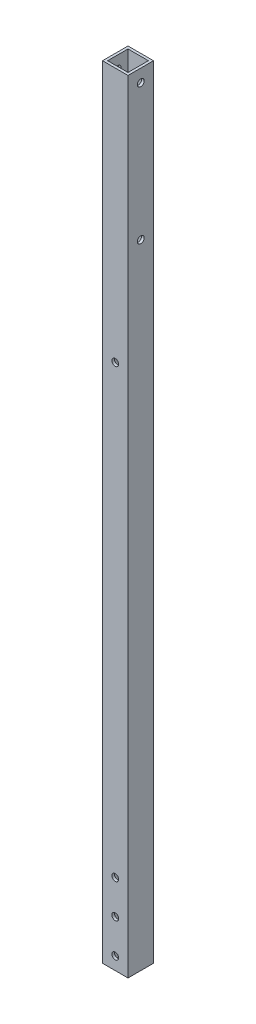
ISO-10303-21;
HEADER;
FILE_DESCRIPTION(('STEP AP214'),'2;1');
FILE_NAME('part.step','',(''),(''),'','','');
FILE_SCHEMA(('AUTOMOTIVE_DESIGN { 1 0 10303 214 1 1 1 1 }'));
ENDSEC;
DATA;
#1=APPLICATION_CONTEXT('core data for automotive mechanical design processes');
#2=APPLICATION_PROTOCOL_DEFINITION('international standard','automotive_design',2000,#1);
#3=PRODUCT_CONTEXT('',#1,'mechanical');
#4=PRODUCT('Part','Part','',(#3));
#5=PRODUCT_RELATED_PRODUCT_CATEGORY('part','',(#4));
#6=PRODUCT_DEFINITION_FORMATION('','',#4);
#7=PRODUCT_DEFINITION_CONTEXT('part definition',#1,'design');
#8=PRODUCT_DEFINITION('design','',#6,#7);
#9=PRODUCT_DEFINITION_SHAPE('','',#8);
#10=(LENGTH_UNIT() NAMED_UNIT(*) SI_UNIT(.MILLI.,.METRE.));
#11=(NAMED_UNIT(*) PLANE_ANGLE_UNIT() SI_UNIT($,.RADIAN.));
#12=(NAMED_UNIT(*) SI_UNIT($,.STERADIAN.) SOLID_ANGLE_UNIT());
#13=UNCERTAINTY_MEASURE_WITH_UNIT(LENGTH_MEASURE(1.E-05),#10,'distance_accuracy_value','');
#14=(GEOMETRIC_REPRESENTATION_CONTEXT(3) GLOBAL_UNCERTAINTY_ASSIGNED_CONTEXT((#13)) GLOBAL_UNIT_ASSIGNED_CONTEXT((#10,
#11,#12)) REPRESENTATION_CONTEXT('',''));
#15=CARTESIAN_POINT('',(0.,0.,0.));
#16=DIRECTION('',(0.,0.,1.));
#17=DIRECTION('',(1.,0.,0.));
#18=AXIS2_PLACEMENT_3D('',#15,#16,#17);
#19=CARTESIAN_POINT('',(0.,460.,0.));
#20=DIRECTION('',(0.,1.,0.));
#21=DIRECTION('',(0.,0.,1.));
#22=AXIS2_PLACEMENT_3D('',#19,#20,#21);
#23=PLANE('',#22);
#24=DIRECTION('',(0.,0.,-1.));
#25=VECTOR('',#24,1.);
#26=CARTESIAN_POINT('',(7.5,460.,7.5));
#27=LINE('',#26,#25);
#28=CARTESIAN_POINT('',(7.5,460.,7.5));
#29=VERTEX_POINT('',#28);
#30=CARTESIAN_POINT('',(7.5,460.,-7.5));
#31=VERTEX_POINT('',#30);
#32=EDGE_CURVE('E162',#29,#31,#27,.T.);
#33=ORIENTED_EDGE('',*,*,#32,.T.);
#34=DIRECTION('',(-1.,0.,0.));
#35=VECTOR('',#34,1.);
#36=CARTESIAN_POINT('',(-7.5,460.,-7.5));
#37=LINE('',#36,#35);
#38=CARTESIAN_POINT('',(-7.5,460.,-7.5));
#39=VERTEX_POINT('',#38);
#40=EDGE_CURVE('E165',#31,#39,#37,.T.);
#41=ORIENTED_EDGE('',*,*,#40,.T.);
#42=DIRECTION('',(0.,0.,1.));
#43=VECTOR('',#42,1.);
#44=CARTESIAN_POINT('',(-7.5,460.,7.5));
#45=LINE('',#44,#43);
#46=CARTESIAN_POINT('',(-7.5,460.,7.5));
#47=VERTEX_POINT('',#46);
#48=EDGE_CURVE('E168',#39,#47,#45,.T.);
#49=ORIENTED_EDGE('',*,*,#48,.T.);
#50=DIRECTION('',(1.,0.,0.));
#51=VECTOR('',#50,1.);
#52=CARTESIAN_POINT('',(-7.5,460.,7.5));
#53=LINE('',#52,#51);
#54=EDGE_CURVE('E170',#47,#29,#53,.T.);
#55=ORIENTED_EDGE('',*,*,#54,.T.);
#56=EDGE_LOOP('',(#33,#41,#49,#55));
#57=FACE_BOUND('',#56,.T.);
#58=DIRECTION('',(-1.,0.,0.));
#59=VECTOR('',#58,1.);
#60=CARTESIAN_POINT('',(0.,460.,-6.));
#61=LINE('',#60,#59);
#62=CARTESIAN_POINT('',(6.,460.,-6.));
#63=VERTEX_POINT('',#62);
#64=CARTESIAN_POINT('',(-6.,460.,-6.));
#65=VERTEX_POINT('',#64);
#66=EDGE_CURVE('E132',#63,#65,#61,.T.);
#67=ORIENTED_EDGE('',*,*,#66,.F.);
#68=DIRECTION('',(0.,0.,-1.));
#69=VECTOR('',#68,1.);
#70=CARTESIAN_POINT('',(6.,460.,0.));
#71=LINE('',#70,#69);
#72=CARTESIAN_POINT('',(6.,460.,6.));
#73=VERTEX_POINT('',#72);
#74=EDGE_CURVE('E124',#73,#63,#71,.T.);
#75=ORIENTED_EDGE('',*,*,#74,.F.);
#76=DIRECTION('',(1.,0.,0.));
#77=VECTOR('',#76,1.);
#78=CARTESIAN_POINT('',(0.,460.,6.));
#79=LINE('',#78,#77);
#80=CARTESIAN_POINT('',(-6.,460.,6.));
#81=VERTEX_POINT('',#80);
#82=EDGE_CURVE('E146',#81,#73,#79,.T.);
#83=ORIENTED_EDGE('',*,*,#82,.F.);
#84=DIRECTION('',(0.,0.,1.));
#85=VECTOR('',#84,1.);
#86=CARTESIAN_POINT('',(-6.,460.,0.));
#87=LINE('',#86,#85);
#88=EDGE_CURVE('E144',#65,#81,#87,.T.);
#89=ORIENTED_EDGE('',*,*,#88,.F.);
#90=EDGE_LOOP('',(#67,#75,#83,#89));
#91=FACE_BOUND('',#90,.T.);
#92=ADVANCED_FACE('F57',(#57,#91),#23,.T.);
#93=CARTESIAN_POINT('',(0.,0.,0.));
#94=DIRECTION('',(0.,1.,0.));
#95=DIRECTION('',(0.,0.,1.));
#96=AXIS2_PLACEMENT_3D('',#93,#94,#95);
#97=PLANE('',#96);
#98=DIRECTION('',(0.,0.,-1.));
#99=VECTOR('',#98,1.);
#100=CARTESIAN_POINT('',(7.5,0.,7.5));
#101=LINE('',#100,#99);
#102=CARTESIAN_POINT('',(7.5,0.,7.5));
#103=VERTEX_POINT('',#102);
#104=CARTESIAN_POINT('',(7.5,0.,-7.5));
#105=VERTEX_POINT('',#104);
#106=EDGE_CURVE('E140',#103,#105,#101,.T.);
#107=ORIENTED_EDGE('',*,*,#106,.F.);
#108=DIRECTION('',(1.,0.,0.));
#109=VECTOR('',#108,1.);
#110=CARTESIAN_POINT('',(-7.5,0.,7.5));
#111=LINE('',#110,#109);
#112=CARTESIAN_POINT('',(-7.5,0.,7.5));
#113=VERTEX_POINT('',#112);
#114=EDGE_CURVE('E166',#113,#103,#111,.T.);
#115=ORIENTED_EDGE('',*,*,#114,.F.);
#116=DIRECTION('',(0.,0.,1.));
#117=VECTOR('',#116,1.);
#118=CARTESIAN_POINT('',(-7.5,0.,7.5));
#119=LINE('',#118,#117);
#120=CARTESIAN_POINT('',(-7.5,0.,-7.5));
#121=VERTEX_POINT('',#120);
#122=EDGE_CURVE('E177',#121,#113,#119,.T.);
#123=ORIENTED_EDGE('',*,*,#122,.F.);
#124=DIRECTION('',(-1.,0.,0.));
#125=VECTOR('',#124,1.);
#126=CARTESIAN_POINT('',(-7.5,0.,-7.5));
#127=LINE('',#126,#125);
#128=EDGE_CURVE('E175',#105,#121,#127,.T.);
#129=ORIENTED_EDGE('',*,*,#128,.F.);
#130=EDGE_LOOP('',(#107,#115,#123,#129));
#131=FACE_BOUND('',#130,.T.);
#132=DIRECTION('',(0.,0.,-1.));
#133=VECTOR('',#132,1.);
#134=CARTESIAN_POINT('',(6.,0.,0.));
#135=LINE('',#134,#133);
#136=CARTESIAN_POINT('',(6.,0.,6.));
#137=VERTEX_POINT('',#136);
#138=CARTESIAN_POINT('',(6.,0.,-6.));
#139=VERTEX_POINT('',#138);
#140=EDGE_CURVE('E82',#137,#139,#135,.T.);
#141=ORIENTED_EDGE('',*,*,#140,.T.);
#142=DIRECTION('',(-1.,0.,0.));
#143=VECTOR('',#142,1.);
#144=CARTESIAN_POINT('',(0.,0.,-6.));
#145=LINE('',#144,#143);
#146=CARTESIAN_POINT('',(-6.,0.,-6.));
#147=VERTEX_POINT('',#146);
#148=EDGE_CURVE('E139',#139,#147,#145,.T.);
#149=ORIENTED_EDGE('',*,*,#148,.T.);
#150=DIRECTION('',(0.,0.,1.));
#151=VECTOR('',#150,1.);
#152=CARTESIAN_POINT('',(-6.,0.,0.));
#153=LINE('',#152,#151);
#154=CARTESIAN_POINT('',(-6.,0.,6.));
#155=VERTEX_POINT('',#154);
#156=EDGE_CURVE('E154',#147,#155,#153,.T.);
#157=ORIENTED_EDGE('',*,*,#156,.T.);
#158=DIRECTION('',(1.,0.,0.));
#159=VECTOR('',#158,1.);
#160=CARTESIAN_POINT('',(0.,0.,6.));
#161=LINE('',#160,#159);
#162=EDGE_CURVE('E133',#155,#137,#161,.T.);
#163=ORIENTED_EDGE('',*,*,#162,.T.);
#164=EDGE_LOOP('',(#141,#149,#157,#163));
#165=FACE_BOUND('',#164,.T.);
#166=ADVANCED_FACE('F255',(#131,#165),#97,.F.);
#167=CARTESIAN_POINT('',(7.5,460.,7.5));
#168=DIRECTION('',(-1.,0.,0.));
#169=DIRECTION('',(0.,0.,1.));
#170=AXIS2_PLACEMENT_3D('',#167,#168,#169);
#171=PLANE('',#170);
#172=CARTESIAN_POINT('',(7.5,452.5,0.));
#173=DIRECTION('',(1.,0.,0.));
#174=DIRECTION('',(0.,0.,-1.));
#175=AXIS2_PLACEMENT_3D('',#172,#173,#174);
#176=CIRCLE('',#175,2.);
#177=CARTESIAN_POINT('',(7.5,452.5,-2.));
#178=VERTEX_POINT('',#177);
#179=EDGE_CURVE('E223',#178,#178,#176,.T.);
#180=ORIENTED_EDGE('',*,*,#179,.F.);
#181=EDGE_LOOP('',(#180));
#182=FACE_BOUND('',#181,.T.);
#183=CARTESIAN_POINT('',(7.5,372.5,0.));
#184=DIRECTION('',(1.,0.,0.));
#185=DIRECTION('',(0.,0.,-1.));
#186=AXIS2_PLACEMENT_3D('',#183,#184,#185);
#187=CIRCLE('',#186,2.);
#188=CARTESIAN_POINT('',(7.5,372.5,-2.));
#189=VERTEX_POINT('',#188);
#190=EDGE_CURVE('E220',#189,#189,#187,.T.);
#191=ORIENTED_EDGE('',*,*,#190,.F.);
#192=EDGE_LOOP('',(#191));
#193=FACE_BOUND('',#192,.T.);
#194=ORIENTED_EDGE('',*,*,#106,.T.);
#195=DIRECTION('',(0.,-1.,0.));
#196=VECTOR('',#195,1.);
#197=CARTESIAN_POINT('',(7.5,460.,-7.5));
#198=LINE('',#197,#196);
#199=EDGE_CURVE('E12',#31,#105,#198,.T.);
#200=ORIENTED_EDGE('',*,*,#199,.F.);
#201=ORIENTED_EDGE('',*,*,#32,.F.);
#202=DIRECTION('',(0.,-1.,0.));
#203=VECTOR('',#202,1.);
#204=CARTESIAN_POINT('',(7.5,460.,7.5));
#205=LINE('',#204,#203);
#206=EDGE_CURVE('E172',#29,#103,#205,.T.);
#207=ORIENTED_EDGE('',*,*,#206,.T.);
#208=EDGE_LOOP('',(#194,#200,#201,#207));
#209=FACE_BOUND('',#208,.T.);
#210=ADVANCED_FACE('F59',(#182,#193,#209),#171,.F.);
#211=CARTESIAN_POINT('',(-7.5,460.,-7.5));
#212=DIRECTION('',(0.,0.,1.));
#213=DIRECTION('',(1.,0.,0.));
#214=AXIS2_PLACEMENT_3D('',#211,#212,#213);
#215=PLANE('',#214);
#216=CARTESIAN_POINT('',(0.,7.5,-7.5));
#217=DIRECTION('',(0.,0.,1.));
#218=DIRECTION('',(1.,0.,0.));
#219=AXIS2_PLACEMENT_3D('',#216,#217,#218);
#220=CIRCLE('',#219,2.);
#221=CARTESIAN_POINT('',(2.,7.5,-7.5));
#222=VERTEX_POINT('',#221);
#223=EDGE_CURVE('E199',#222,#222,#220,.T.);
#224=ORIENTED_EDGE('',*,*,#223,.T.);
#225=EDGE_LOOP('',(#224));
#226=FACE_BOUND('',#225,.T.);
#227=CARTESIAN_POINT('',(0.,47.5,-7.5));
#228=DIRECTION('',(0.,0.,1.));
#229=DIRECTION('',(1.,0.,0.));
#230=AXIS2_PLACEMENT_3D('',#227,#228,#229);
#231=CIRCLE('',#230,2.);
#232=CARTESIAN_POINT('',(2.,47.5,-7.5));
#233=VERTEX_POINT('',#232);
#234=EDGE_CURVE('E345',#233,#233,#231,.T.);
#235=ORIENTED_EDGE('',*,*,#234,.T.);
#236=EDGE_LOOP('',(#235));
#237=FACE_BOUND('',#236,.T.);
#238=CARTESIAN_POINT('',(0.,27.5,-7.5));
#239=DIRECTION('',(0.,0.,1.));
#240=DIRECTION('',(1.,0.,0.));
#241=AXIS2_PLACEMENT_3D('',#238,#239,#240);
#242=CIRCLE('',#241,2.);
#243=CARTESIAN_POINT('',(2.,27.5,-7.5));
#244=VERTEX_POINT('',#243);
#245=EDGE_CURVE('E353',#244,#244,#242,.T.);
#246=ORIENTED_EDGE('',*,*,#245,.T.);
#247=EDGE_LOOP('',(#246));
#248=FACE_BOUND('',#247,.T.);
#249=CARTESIAN_POINT('',(0.,310.,-7.5));
#250=DIRECTION('',(0.,0.,1.));
#251=DIRECTION('',(1.,0.,0.));
#252=AXIS2_PLACEMENT_3D('',#249,#250,#251);
#253=CIRCLE('',#252,2.);
#254=CARTESIAN_POINT('',(2.,310.,-7.5));
#255=VERTEX_POINT('',#254);
#256=EDGE_CURVE('E359',#255,#255,#253,.T.);
#257=ORIENTED_EDGE('',*,*,#256,.T.);
#258=EDGE_LOOP('',(#257));
#259=FACE_BOUND('',#258,.T.);
#260=ORIENTED_EDGE('',*,*,#128,.T.);
#261=DIRECTION('',(0.,-1.,0.));
#262=VECTOR('',#261,1.);
#263=CARTESIAN_POINT('',(-7.5,460.,-7.5));
#264=LINE('',#263,#262);
#265=EDGE_CURVE('E66',#39,#121,#264,.T.);
#266=ORIENTED_EDGE('',*,*,#265,.F.);
#267=ORIENTED_EDGE('',*,*,#40,.F.);
#268=ORIENTED_EDGE('',*,*,#199,.T.);
#269=EDGE_LOOP('',(#260,#266,#267,#268));
#270=FACE_BOUND('',#269,.T.);
#271=ADVANCED_FACE('F254',(#226,#237,#248,#259,#270),#215,.F.);
#272=CARTESIAN_POINT('',(-7.5,460.,7.5));
#273=DIRECTION('',(1.,0.,0.));
#274=DIRECTION('',(0.,0.,-1.));
#275=AXIS2_PLACEMENT_3D('',#272,#273,#274);
#276=PLANE('',#275);
#277=CARTESIAN_POINT('',(-7.5,452.5,0.));
#278=DIRECTION('',(1.,0.,0.));
#279=DIRECTION('',(0.,0.,-1.));
#280=AXIS2_PLACEMENT_3D('',#277,#278,#279);
#281=CIRCLE('',#280,2.);
#282=CARTESIAN_POINT('',(-7.5,452.5,-2.));
#283=VERTEX_POINT('',#282);
#284=EDGE_CURVE('E191',#283,#283,#281,.T.);
#285=ORIENTED_EDGE('',*,*,#284,.T.);
#286=EDGE_LOOP('',(#285));
#287=FACE_BOUND('',#286,.T.);
#288=CARTESIAN_POINT('',(-7.5,372.5,0.));
#289=DIRECTION('',(1.,0.,0.));
#290=DIRECTION('',(0.,0.,-1.));
#291=AXIS2_PLACEMENT_3D('',#288,#289,#290);
#292=CIRCLE('',#291,2.);
#293=CARTESIAN_POINT('',(-7.5,372.5,-2.));
#294=VERTEX_POINT('',#293);
#295=EDGE_CURVE('E226',#294,#294,#292,.T.);
#296=ORIENTED_EDGE('',*,*,#295,.T.);
#297=EDGE_LOOP('',(#296));
#298=FACE_BOUND('',#297,.T.);
#299=ORIENTED_EDGE('',*,*,#122,.T.);
#300=DIRECTION('',(0.,-1.,0.));
#301=VECTOR('',#300,1.);
#302=CARTESIAN_POINT('',(-7.5,460.,7.5));
#303=LINE('',#302,#301);
#304=EDGE_CURVE('E182',#47,#113,#303,.T.);
#305=ORIENTED_EDGE('',*,*,#304,.F.);
#306=ORIENTED_EDGE('',*,*,#48,.F.);
#307=ORIENTED_EDGE('',*,*,#265,.T.);
#308=EDGE_LOOP('',(#299,#305,#306,#307));
#309=FACE_BOUND('',#308,.T.);
#310=ADVANCED_FACE('F273',(#287,#298,#309),#276,.F.);
#311=CARTESIAN_POINT('',(-7.5,460.,7.5));
#312=DIRECTION('',(0.,0.,-1.));
#313=DIRECTION('',(-1.,0.,0.));
#314=AXIS2_PLACEMENT_3D('',#311,#312,#313);
#315=PLANE('',#314);
#316=CARTESIAN_POINT('',(0.,7.5,7.5));
#317=DIRECTION('',(0.,0.,1.));
#318=DIRECTION('',(1.,0.,0.));
#319=AXIS2_PLACEMENT_3D('',#316,#317,#318);
#320=CIRCLE('',#319,2.);
#321=CARTESIAN_POINT('',(2.,7.5,7.5));
#322=VERTEX_POINT('',#321);
#323=EDGE_CURVE('E342',#322,#322,#320,.T.);
#324=ORIENTED_EDGE('',*,*,#323,.F.);
#325=EDGE_LOOP('',(#324));
#326=FACE_BOUND('',#325,.T.);
#327=CARTESIAN_POINT('',(0.,47.5,7.5));
#328=DIRECTION('',(0.,0.,1.));
#329=DIRECTION('',(1.,0.,0.));
#330=AXIS2_PLACEMENT_3D('',#327,#328,#329);
#331=CIRCLE('',#330,2.);
#332=CARTESIAN_POINT('',(2.,47.5,7.5));
#333=VERTEX_POINT('',#332);
#334=EDGE_CURVE('E350',#333,#333,#331,.T.);
#335=ORIENTED_EDGE('',*,*,#334,.F.);
#336=EDGE_LOOP('',(#335));
#337=FACE_BOUND('',#336,.T.);
#338=CARTESIAN_POINT('',(0.,27.5,7.5));
#339=DIRECTION('',(0.,0.,1.));
#340=DIRECTION('',(1.,0.,0.));
#341=AXIS2_PLACEMENT_3D('',#338,#339,#340);
#342=CIRCLE('',#341,2.);
#343=CARTESIAN_POINT('',(2.,27.5,7.5));
#344=VERTEX_POINT('',#343);
#345=EDGE_CURVE('E356',#344,#344,#342,.T.);
#346=ORIENTED_EDGE('',*,*,#345,.F.);
#347=EDGE_LOOP('',(#346));
#348=FACE_BOUND('',#347,.T.);
#349=CARTESIAN_POINT('',(0.,310.,7.5));
#350=DIRECTION('',(0.,0.,1.));
#351=DIRECTION('',(1.,0.,0.));
#352=AXIS2_PLACEMENT_3D('',#349,#350,#351);
#353=CIRCLE('',#352,2.);
#354=CARTESIAN_POINT('',(2.,310.,7.5));
#355=VERTEX_POINT('',#354);
#356=EDGE_CURVE('E361',#355,#355,#353,.T.);
#357=ORIENTED_EDGE('',*,*,#356,.F.);
#358=EDGE_LOOP('',(#357));
#359=FACE_BOUND('',#358,.T.);
#360=ORIENTED_EDGE('',*,*,#114,.T.);
#361=ORIENTED_EDGE('',*,*,#206,.F.);
#362=ORIENTED_EDGE('',*,*,#54,.F.);
#363=ORIENTED_EDGE('',*,*,#304,.T.);
#364=EDGE_LOOP('',(#360,#361,#362,#363));
#365=FACE_BOUND('',#364,.T.);
#366=ADVANCED_FACE('F240',(#326,#337,#348,#359,#365),#315,.F.);
#367=CARTESIAN_POINT('',(6.,460.,0.));
#368=DIRECTION('',(-1.,0.,0.));
#369=DIRECTION('',(0.,0.,1.));
#370=AXIS2_PLACEMENT_3D('',#367,#368,#369);
#371=PLANE('',#370);
#372=CARTESIAN_POINT('',(6.,452.5,0.));
#373=DIRECTION('',(-1.,0.,0.));
#374=DIRECTION('',(0.,0.,1.));
#375=AXIS2_PLACEMENT_3D('',#372,#373,#374);
#376=CIRCLE('',#375,2.);
#377=CARTESIAN_POINT('',(6.,452.5,2.));
#378=VERTEX_POINT('',#377);
#379=EDGE_CURVE('E152',#378,#378,#376,.T.);
#380=ORIENTED_EDGE('',*,*,#379,.F.);
#381=EDGE_LOOP('',(#380));
#382=FACE_BOUND('',#381,.T.);
#383=CARTESIAN_POINT('',(6.,372.5,0.));
#384=DIRECTION('',(-1.,0.,0.));
#385=DIRECTION('',(0.,0.,1.));
#386=AXIS2_PLACEMENT_3D('',#383,#384,#385);
#387=CIRCLE('',#386,2.);
#388=CARTESIAN_POINT('',(6.,372.5,2.));
#389=VERTEX_POINT('',#388);
#390=EDGE_CURVE('E190',#389,#389,#387,.T.);
#391=ORIENTED_EDGE('',*,*,#390,.F.);
#392=EDGE_LOOP('',(#391));
#393=FACE_BOUND('',#392,.T.);
#394=ORIENTED_EDGE('',*,*,#140,.F.);
#395=DIRECTION('',(0.,-1.,0.));
#396=VECTOR('',#395,1.);
#397=CARTESIAN_POINT('',(6.,460.,6.));
#398=LINE('',#397,#396);
#399=EDGE_CURVE('E128',#73,#137,#398,.T.);
#400=ORIENTED_EDGE('',*,*,#399,.F.);
#401=ORIENTED_EDGE('',*,*,#74,.T.);
#402=DIRECTION('',(0.,-1.,0.));
#403=VECTOR('',#402,1.);
#404=CARTESIAN_POINT('',(6.,460.,-6.));
#405=LINE('',#404,#403);
#406=EDGE_CURVE('E127',#63,#139,#405,.T.);
#407=ORIENTED_EDGE('',*,*,#406,.T.);
#408=EDGE_LOOP('',(#394,#400,#401,#407));
#409=FACE_BOUND('',#408,.T.);
#410=ADVANCED_FACE('F126',(#382,#393,#409),#371,.T.);
#411=CARTESIAN_POINT('',(0.,460.,-6.));
#412=DIRECTION('',(0.,0.,1.));
#413=DIRECTION('',(1.,0.,0.));
#414=AXIS2_PLACEMENT_3D('',#411,#412,#413);
#415=PLANE('',#414);
#416=CARTESIAN_POINT('',(0.,7.5,-6.));
#417=DIRECTION('',(0.,0.,1.));
#418=DIRECTION('',(1.,0.,0.));
#419=AXIS2_PLACEMENT_3D('',#416,#417,#418);
#420=CIRCLE('',#419,2.);
#421=CARTESIAN_POINT('',(2.,7.5,-6.));
#422=VERTEX_POINT('',#421);
#423=EDGE_CURVE('E217',#422,#422,#420,.T.);
#424=ORIENTED_EDGE('',*,*,#423,.F.);
#425=EDGE_LOOP('',(#424));
#426=FACE_BOUND('',#425,.T.);
#427=CARTESIAN_POINT('',(0.,47.5,-6.));
#428=DIRECTION('',(0.,0.,1.));
#429=DIRECTION('',(1.,0.,0.));
#430=AXIS2_PLACEMENT_3D('',#427,#428,#429);
#431=CIRCLE('',#430,2.);
#432=CARTESIAN_POINT('',(2.,47.5,-6.));
#433=VERTEX_POINT('',#432);
#434=EDGE_CURVE('E205',#433,#433,#431,.T.);
#435=ORIENTED_EDGE('',*,*,#434,.F.);
#436=EDGE_LOOP('',(#435));
#437=FACE_BOUND('',#436,.T.);
#438=CARTESIAN_POINT('',(0.,27.5,-6.));
#439=DIRECTION('',(0.,0.,1.));
#440=DIRECTION('',(1.,0.,0.));
#441=AXIS2_PLACEMENT_3D('',#438,#439,#440);
#442=CIRCLE('',#441,2.);
#443=CARTESIAN_POINT('',(2.,27.5,-6.));
#444=VERTEX_POINT('',#443);
#445=EDGE_CURVE('E202',#444,#444,#442,.T.);
#446=ORIENTED_EDGE('',*,*,#445,.F.);
#447=EDGE_LOOP('',(#446));
#448=FACE_BOUND('',#447,.T.);
#449=CARTESIAN_POINT('',(0.,310.,-6.));
#450=DIRECTION('',(0.,0.,1.));
#451=DIRECTION('',(1.,0.,0.));
#452=AXIS2_PLACEMENT_3D('',#449,#450,#451);
#453=CIRCLE('',#452,2.);
#454=CARTESIAN_POINT('',(2.,310.,-6.));
#455=VERTEX_POINT('',#454);
#456=EDGE_CURVE('E198',#455,#455,#453,.T.);
#457=ORIENTED_EDGE('',*,*,#456,.F.);
#458=EDGE_LOOP('',(#457));
#459=FACE_BOUND('',#458,.T.);
#460=ORIENTED_EDGE('',*,*,#148,.F.);
#461=ORIENTED_EDGE('',*,*,#406,.F.);
#462=ORIENTED_EDGE('',*,*,#66,.T.);
#463=DIRECTION('',(0.,-1.,0.));
#464=VECTOR('',#463,1.);
#465=CARTESIAN_POINT('',(-6.,460.,-6.));
#466=LINE('',#465,#464);
#467=EDGE_CURVE('E141',#65,#147,#466,.T.);
#468=ORIENTED_EDGE('',*,*,#467,.T.);
#469=EDGE_LOOP('',(#460,#461,#462,#468));
#470=FACE_BOUND('',#469,.T.);
#471=ADVANCED_FACE('F136',(#426,#437,#448,#459,#470),#415,.T.);
#472=CARTESIAN_POINT('',(-6.,460.,0.));
#473=DIRECTION('',(1.,0.,0.));
#474=DIRECTION('',(0.,0.,-1.));
#475=AXIS2_PLACEMENT_3D('',#472,#473,#474);
#476=PLANE('',#475);
#477=CARTESIAN_POINT('',(-6.,452.5,0.));
#478=DIRECTION('',(1.,0.,0.));
#479=DIRECTION('',(0.,0.,-1.));
#480=AXIS2_PLACEMENT_3D('',#477,#478,#479);
#481=CIRCLE('',#480,2.);
#482=CARTESIAN_POINT('',(-6.,452.5,-2.));
#483=VERTEX_POINT('',#482);
#484=EDGE_CURVE('E192',#483,#483,#481,.T.);
#485=ORIENTED_EDGE('',*,*,#484,.F.);
#486=EDGE_LOOP('',(#485));
#487=FACE_BOUND('',#486,.T.);
#488=CARTESIAN_POINT('',(-6.,372.5,0.));
#489=DIRECTION('',(1.,0.,0.));
#490=DIRECTION('',(0.,0.,-1.));
#491=AXIS2_PLACEMENT_3D('',#488,#489,#490);
#492=CIRCLE('',#491,2.);
#493=CARTESIAN_POINT('',(-6.,372.5,-2.));
#494=VERTEX_POINT('',#493);
#495=EDGE_CURVE('E187',#494,#494,#492,.T.);
#496=ORIENTED_EDGE('',*,*,#495,.F.);
#497=EDGE_LOOP('',(#496));
#498=FACE_BOUND('',#497,.T.);
#499=ORIENTED_EDGE('',*,*,#156,.F.);
#500=ORIENTED_EDGE('',*,*,#467,.F.);
#501=ORIENTED_EDGE('',*,*,#88,.T.);
#502=DIRECTION('',(0.,-1.,0.));
#503=VECTOR('',#502,1.);
#504=CARTESIAN_POINT('',(-6.,460.,6.));
#505=LINE('',#504,#503);
#506=EDGE_CURVE('E74',#81,#155,#505,.T.);
#507=ORIENTED_EDGE('',*,*,#506,.T.);
#508=EDGE_LOOP('',(#499,#500,#501,#507));
#509=FACE_BOUND('',#508,.T.);
#510=ADVANCED_FACE('F294',(#487,#498,#509),#476,.T.);
#511=CARTESIAN_POINT('',(0.,460.,6.));
#512=DIRECTION('',(0.,0.,-1.));
#513=DIRECTION('',(-1.,0.,0.));
#514=AXIS2_PLACEMENT_3D('',#511,#512,#513);
#515=PLANE('',#514);
#516=CARTESIAN_POINT('',(0.,7.5,6.));
#517=DIRECTION('',(0.,0.,-1.));
#518=DIRECTION('',(-1.,0.,0.));
#519=AXIS2_PLACEMENT_3D('',#516,#517,#518);
#520=CIRCLE('',#519,2.);
#521=CARTESIAN_POINT('',(-2.,7.5,6.));
#522=VERTEX_POINT('',#521);
#523=EDGE_CURVE('E61',#522,#522,#520,.T.);
#524=ORIENTED_EDGE('',*,*,#523,.F.);
#525=EDGE_LOOP('',(#524));
#526=FACE_BOUND('',#525,.T.);
#527=CARTESIAN_POINT('',(0.,47.5,6.));
#528=DIRECTION('',(0.,0.,-1.));
#529=DIRECTION('',(-1.,0.,0.));
#530=AXIS2_PLACEMENT_3D('',#527,#528,#529);
#531=CIRCLE('',#530,2.);
#532=CARTESIAN_POINT('',(-2.,47.5,6.));
#533=VERTEX_POINT('',#532);
#534=EDGE_CURVE('E203',#533,#533,#531,.T.);
#535=ORIENTED_EDGE('',*,*,#534,.F.);
#536=EDGE_LOOP('',(#535));
#537=FACE_BOUND('',#536,.T.);
#538=CARTESIAN_POINT('',(0.,27.5,6.));
#539=DIRECTION('',(0.,0.,-1.));
#540=DIRECTION('',(-1.,0.,0.));
#541=AXIS2_PLACEMENT_3D('',#538,#539,#540);
#542=CIRCLE('',#541,2.);
#543=CARTESIAN_POINT('',(-2.,27.5,6.));
#544=VERTEX_POINT('',#543);
#545=EDGE_CURVE('E200',#544,#544,#542,.T.);
#546=ORIENTED_EDGE('',*,*,#545,.F.);
#547=EDGE_LOOP('',(#546));
#548=FACE_BOUND('',#547,.T.);
#549=CARTESIAN_POINT('',(0.,310.,6.));
#550=DIRECTION('',(0.,0.,-1.));
#551=DIRECTION('',(-1.,0.,0.));
#552=AXIS2_PLACEMENT_3D('',#549,#550,#551);
#553=CIRCLE('',#552,2.);
#554=CARTESIAN_POINT('',(-2.,310.,6.));
#555=VERTEX_POINT('',#554);
#556=EDGE_CURVE('E195',#555,#555,#553,.T.);
#557=ORIENTED_EDGE('',*,*,#556,.F.);
#558=EDGE_LOOP('',(#557));
#559=FACE_BOUND('',#558,.T.);
#560=ORIENTED_EDGE('',*,*,#162,.F.);
#561=ORIENTED_EDGE('',*,*,#506,.F.);
#562=ORIENTED_EDGE('',*,*,#82,.T.);
#563=ORIENTED_EDGE('',*,*,#399,.T.);
#564=EDGE_LOOP('',(#560,#561,#562,#563));
#565=FACE_BOUND('',#564,.T.);
#566=ADVANCED_FACE('F298',(#526,#537,#548,#559,#565),#515,.T.);
#567=CARTESIAN_POINT('',(-7.5,372.5,0.));
#568=DIRECTION('',(1.,0.,0.));
#569=DIRECTION('',(0.,0.,-1.));
#570=AXIS2_PLACEMENT_3D('',#567,#568,#569);
#571=CYLINDRICAL_SURFACE('',#570,2.);
#572=ORIENTED_EDGE('',*,*,#495,.T.);
#573=EDGE_LOOP('',(#572));
#574=FACE_BOUND('',#573,.T.);
#575=ORIENTED_EDGE('',*,*,#295,.F.);
#576=EDGE_LOOP('',(#575));
#577=FACE_BOUND('',#576,.T.);
#578=ADVANCED_FACE('F249',(#574,#577),#571,.F.);
#579=CARTESIAN_POINT('',(-7.5,452.5,0.));
#580=DIRECTION('',(1.,0.,0.));
#581=DIRECTION('',(0.,0.,-1.));
#582=AXIS2_PLACEMENT_3D('',#579,#580,#581);
#583=CYLINDRICAL_SURFACE('',#582,2.);
#584=ORIENTED_EDGE('',*,*,#484,.T.);
#585=EDGE_LOOP('',(#584));
#586=FACE_BOUND('',#585,.T.);
#587=ORIENTED_EDGE('',*,*,#284,.F.);
#588=EDGE_LOOP('',(#587));
#589=FACE_BOUND('',#588,.T.);
#590=ADVANCED_FACE('F247',(#586,#589),#583,.F.);
#591=ORIENTED_EDGE('',*,*,#390,.T.);
#592=EDGE_LOOP('',(#591));
#593=FACE_BOUND('',#592,.T.);
#594=ORIENTED_EDGE('',*,*,#190,.T.);
#595=EDGE_LOOP('',(#594));
#596=FACE_BOUND('',#595,.T.);
#597=ADVANCED_FACE('F244',(#593,#596),#571,.F.);
#598=ORIENTED_EDGE('',*,*,#379,.T.);
#599=EDGE_LOOP('',(#598));
#600=FACE_BOUND('',#599,.T.);
#601=ORIENTED_EDGE('',*,*,#179,.T.);
#602=EDGE_LOOP('',(#601));
#603=FACE_BOUND('',#602,.T.);
#604=ADVANCED_FACE('F235',(#600,#603),#583,.F.);
#605=CARTESIAN_POINT('',(0.,310.,-7.5));
#606=DIRECTION('',(0.,0.,1.));
#607=DIRECTION('',(1.,0.,0.));
#608=AXIS2_PLACEMENT_3D('',#605,#606,#607);
#609=CYLINDRICAL_SURFACE('',#608,2.);
#610=ORIENTED_EDGE('',*,*,#556,.T.);
#611=EDGE_LOOP('',(#610));
#612=FACE_BOUND('',#611,.T.);
#613=ORIENTED_EDGE('',*,*,#356,.T.);
#614=EDGE_LOOP('',(#613));
#615=FACE_BOUND('',#614,.T.);
#616=ADVANCED_FACE('F308',(#612,#615),#609,.F.);
#617=CARTESIAN_POINT('',(0.,27.5,-7.5));
#618=DIRECTION('',(0.,0.,1.));
#619=DIRECTION('',(1.,0.,0.));
#620=AXIS2_PLACEMENT_3D('',#617,#618,#619);
#621=CYLINDRICAL_SURFACE('',#620,2.);
#622=ORIENTED_EDGE('',*,*,#545,.T.);
#623=EDGE_LOOP('',(#622));
#624=FACE_BOUND('',#623,.T.);
#625=ORIENTED_EDGE('',*,*,#345,.T.);
#626=EDGE_LOOP('',(#625));
#627=FACE_BOUND('',#626,.T.);
#628=ADVANCED_FACE('F311',(#624,#627),#621,.F.);
#629=CARTESIAN_POINT('',(0.,47.5,-7.5));
#630=DIRECTION('',(0.,0.,1.));
#631=DIRECTION('',(1.,0.,0.));
#632=AXIS2_PLACEMENT_3D('',#629,#630,#631);
#633=CYLINDRICAL_SURFACE('',#632,2.);
#634=ORIENTED_EDGE('',*,*,#534,.T.);
#635=EDGE_LOOP('',(#634));
#636=FACE_BOUND('',#635,.T.);
#637=ORIENTED_EDGE('',*,*,#334,.T.);
#638=EDGE_LOOP('',(#637));
#639=FACE_BOUND('',#638,.T.);
#640=ADVANCED_FACE('F316',(#636,#639),#633,.F.);
#641=CARTESIAN_POINT('',(0.,7.5,-7.5));
#642=DIRECTION('',(0.,0.,1.));
#643=DIRECTION('',(1.,0.,0.));
#644=AXIS2_PLACEMENT_3D('',#641,#642,#643);
#645=CYLINDRICAL_SURFACE('',#644,2.);
#646=ORIENTED_EDGE('',*,*,#523,.T.);
#647=EDGE_LOOP('',(#646));
#648=FACE_BOUND('',#647,.T.);
#649=ORIENTED_EDGE('',*,*,#323,.T.);
#650=EDGE_LOOP('',(#649));
#651=FACE_BOUND('',#650,.T.);
#652=ADVANCED_FACE('F321',(#648,#651),#645,.F.);
#653=ORIENTED_EDGE('',*,*,#456,.T.);
#654=EDGE_LOOP('',(#653));
#655=FACE_BOUND('',#654,.T.);
#656=ORIENTED_EDGE('',*,*,#256,.F.);
#657=EDGE_LOOP('',(#656));
#658=FACE_BOUND('',#657,.T.);
#659=ADVANCED_FACE('F313',(#655,#658),#609,.F.);
#660=ORIENTED_EDGE('',*,*,#445,.T.);
#661=EDGE_LOOP('',(#660));
#662=FACE_BOUND('',#661,.T.);
#663=ORIENTED_EDGE('',*,*,#245,.F.);
#664=EDGE_LOOP('',(#663));
#665=FACE_BOUND('',#664,.T.);
#666=ADVANCED_FACE('F318',(#662,#665),#621,.F.);
#667=ORIENTED_EDGE('',*,*,#434,.T.);
#668=EDGE_LOOP('',(#667));
#669=FACE_BOUND('',#668,.T.);
#670=ORIENTED_EDGE('',*,*,#234,.F.);
#671=EDGE_LOOP('',(#670));
#672=FACE_BOUND('',#671,.T.);
#673=ADVANCED_FACE('F322',(#669,#672),#633,.F.);
#674=ORIENTED_EDGE('',*,*,#423,.T.);
#675=EDGE_LOOP('',(#674));
#676=FACE_BOUND('',#675,.T.);
#677=ORIENTED_EDGE('',*,*,#223,.F.);
#678=EDGE_LOOP('',(#677));
#679=FACE_BOUND('',#678,.T.);
#680=ADVANCED_FACE('F325',(#676,#679),#645,.F.);
#681=CLOSED_SHELL('',(#92,#166,#210,#271,#310,#366,#410,#471,#510,#566,#578,#590,#597,#604,#616,
#628,#640,#652,#659,#666,#673,#680));
#682=MANIFOLD_SOLID_BREP('B2',#681);
#683=ADVANCED_BREP_SHAPE_REPRESENTATION('',(#18,#682),#14);
#684=SHAPE_DEFINITION_REPRESENTATION(#9,#683);
ENDSEC;
END-ISO-10303-21;
